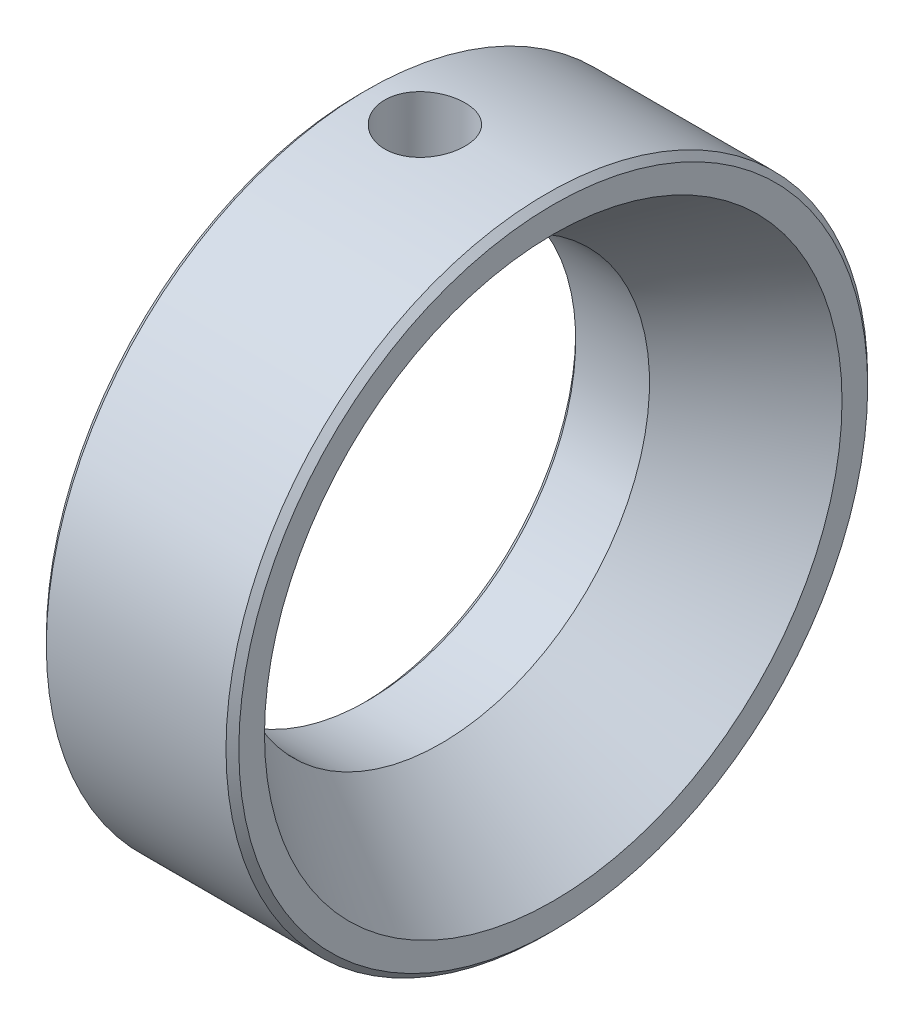
ISO-10303-21;
HEADER;
FILE_DESCRIPTION(('STEP AP214'),'2;1');
FILE_NAME('part.step','',(''),(''),'','','');
FILE_SCHEMA(('AUTOMOTIVE_DESIGN { 1 0 10303 214 1 1 1 1 }'));
ENDSEC;
DATA;
#1=APPLICATION_CONTEXT('core data for automotive mechanical design processes');
#2=APPLICATION_PROTOCOL_DEFINITION('international standard','automotive_design',2000,#1);
#3=PRODUCT_CONTEXT('',#1,'mechanical');
#4=PRODUCT('Part','Part','',(#3));
#5=PRODUCT_RELATED_PRODUCT_CATEGORY('part','',(#4));
#6=PRODUCT_DEFINITION_FORMATION('','',#4);
#7=PRODUCT_DEFINITION_CONTEXT('part definition',#1,'design');
#8=PRODUCT_DEFINITION('design','',#6,#7);
#9=PRODUCT_DEFINITION_SHAPE('','',#8);
#10=(LENGTH_UNIT() NAMED_UNIT(*) SI_UNIT(.MILLI.,.METRE.));
#11=(NAMED_UNIT(*) PLANE_ANGLE_UNIT() SI_UNIT($,.RADIAN.));
#12=(NAMED_UNIT(*) SI_UNIT($,.STERADIAN.) SOLID_ANGLE_UNIT());
#13=UNCERTAINTY_MEASURE_WITH_UNIT(LENGTH_MEASURE(1.E-05),#10,'distance_accuracy_value','');
#14=(GEOMETRIC_REPRESENTATION_CONTEXT(3) GLOBAL_UNCERTAINTY_ASSIGNED_CONTEXT((#13)) GLOBAL_UNIT_ASSIGNED_CONTEXT((#10,
#11,#12)) REPRESENTATION_CONTEXT('',''));
#15=CARTESIAN_POINT('',(0.,0.,0.));
#16=DIRECTION('',(0.,0.,1.));
#17=DIRECTION('',(1.,0.,0.));
#18=AXIS2_PLACEMENT_3D('',#15,#16,#17);
#19=CARTESIAN_POINT('',(-193.536585365854,0.,0.));
#20=DIRECTION('',(-1.,0.,0.));
#21=DIRECTION('',(0.,0.,1.));
#22=AXIS2_PLACEMENT_3D('',#19,#20,#21);
#23=CYLINDRICAL_SURFACE('',#22,100.);
#24=CARTESIAN_POINT('',(-30.1829268292683,100.,0.));
#25=CARTESIAN_POINT('',(-30.1829308421279,100.000001345279,-0.349725302501324));
#26=CARTESIAN_POINT('',(-30.1682446528815,99.9981617707791,-0.699391688691775));
#27=CARTESIAN_POINT('',(-30.1096127013227,99.9908577480781,-1.39633535762782));
#28=CARTESIAN_POINT('',(-30.0656603069873,99.9853924782585,-1.74361208082529));
#29=CARTESIAN_POINT('',(-29.9487579484735,99.9709821059211,-2.4334997742603));
#30=CARTESIAN_POINT('',(-29.8757810800272,99.9620337749405,-2.77610610966412));
#31=CARTESIAN_POINT('',(-29.7013728646584,99.9409103293127,-3.45389697652515));
#32=CARTESIAN_POINT('',(-29.5999415290887,99.9287352159529,-3.78908151094348));
#33=CARTESIAN_POINT('',(-29.3694483377499,99.9015100461544,-4.44943040062663));
#34=CARTESIAN_POINT('',(-29.2404054994425,99.886461969238,-4.77460147722778));
#35=CARTESIAN_POINT('',(-28.9555819271767,99.853907029794,-5.41289046787238));
#36=CARTESIAN_POINT('',(-28.7998008408267,99.8364001348614,-5.7260082229948));
#37=CARTESIAN_POINT('',(-28.4626485483228,99.7994205602292,-6.33795030702529));
#38=CARTESIAN_POINT('',(-28.2812820790651,99.7799482445985,-6.63677726805936));
#39=CARTESIAN_POINT('',(-27.8942201264416,99.7395783001712,-7.21813259637454));
#40=CARTESIAN_POINT('',(-27.6885246215371,99.7186806701129,-7.50066094922603));
#41=CARTESIAN_POINT('',(-27.2531746137099,99.675937434488,-8.04881727021103));
#42=CARTESIAN_POINT('',(-27.0234072680124,99.6540876726453,-8.31435530001055));
#43=CARTESIAN_POINT('',(-26.542365927537,99.6101516457911,-8.82515837005227));
#44=CARTESIAN_POINT('',(-26.291091848628,99.5880653798548,-9.0704233309819));
#45=CARTESIAN_POINT('',(-25.7687755771602,99.5442777895226,-9.53898032252259));
#46=CARTESIAN_POINT('',(-25.4977323948294,99.5225764844681,-9.76227125165179));
#47=CARTESIAN_POINT('',(-24.9377747758836,99.4801733884383,-10.1852986009129));
#48=CARTESIAN_POINT('',(-24.6488603244582,99.4594715982913,-10.3850350015242));
#49=CARTESIAN_POINT('',(-24.0541692527072,99.4195877835601,-10.7601710724128));
#50=CARTESIAN_POINT('',(-23.7483389975624,99.4004111257622,-10.9354863036889));
#51=CARTESIAN_POINT('',(-23.1228650067697,99.3642061645942,-11.2597139301568));
#52=CARTESIAN_POINT('',(-22.8032212302763,99.3471778675772,-11.4086262472709));
#53=CARTESIAN_POINT('',(-22.1523953159606,99.3157616880652,-11.67895586429));
#54=CARTESIAN_POINT('',(-21.8212135201729,99.3013737273788,-11.8003739784381));
#55=CARTESIAN_POINT('',(-21.1496673648154,99.2756552541175,-12.0148220292573));
#56=CARTESIAN_POINT('',(-20.8093030570993,99.2643247242812,-12.107852126199));
#57=CARTESIAN_POINT('',(-20.1236366767638,99.2451018631555,-12.2644181009037));
#58=CARTESIAN_POINT('',(-19.7783697364557,99.2371918608503,-12.3281056815745));
#59=CARTESIAN_POINT('',(-19.0836404926096,99.2249534232538,-12.4262250351781));
#60=CARTESIAN_POINT('',(-18.7341782021958,99.2206249767614,-12.4606568996074));
#61=CARTESIAN_POINT('',(-18.0335821537417,99.2156754886221,-12.5000053033855));
#62=CARTESIAN_POINT('',(-17.682448455685,99.2150543149174,-12.5049228940704));
#63=CARTESIAN_POINT('',(-16.9810254626856,99.2175371041919,-12.4852084121194));
#64=CARTESIAN_POINT('',(-16.630736165152,99.220641055727,-12.4605764302642));
#65=CARTESIAN_POINT('',(-15.9355162025646,99.2304555991274,-12.382173751902));
#66=CARTESIAN_POINT('',(-15.5905663508661,99.237145469763,-12.3285704514853));
#67=CARTESIAN_POINT('',(-14.9064372300568,99.2539266243776,-12.1927325098527));
#68=CARTESIAN_POINT('',(-14.5672579355185,99.2640178933644,-12.1104979948326));
#69=CARTESIAN_POINT('',(-13.8970544914576,99.2873136864925,-11.9180002651356));
#70=CARTESIAN_POINT('',(-13.566030458176,99.3005182549808,-11.8077366511996));
#71=CARTESIAN_POINT('',(-12.9144581537063,99.3296650304773,-11.5599822787197));
#72=CARTESIAN_POINT('',(-12.5939099261978,99.3456072488984,-11.4224914066666));
#73=CARTESIAN_POINT('',(-11.964649835035,99.3798254479636,-11.1208534991564));
#74=CARTESIAN_POINT('',(-11.655973079477,99.3981077480071,-10.9566339439906));
#75=CARTESIAN_POINT('',(-11.0535365537553,99.4364542478611,-10.6029800579611));
#76=CARTESIAN_POINT('',(-10.7597768009632,99.4565184497466,-10.4135456977343));
#77=CARTESIAN_POINT('',(-10.1891919761901,99.4978646888732,-10.0107885709071));
#78=CARTESIAN_POINT('',(-9.91236755821702,99.5191467730852,-9.79746488264905));
#79=CARTESIAN_POINT('',(-9.37757237922909,99.5623315265523,-9.34842235278798));
#80=CARTESIAN_POINT('',(-9.11960170910809,99.5842341987986,-9.11270340323013));
#81=CARTESIAN_POINT('',(-8.62257802168058,99.6281998497906,-8.61879746682115));
#82=CARTESIAN_POINT('',(-8.38366829747984,99.6502628888288,-8.36046626355238));
#83=CARTESIAN_POINT('',(-7.92844534838279,99.6937739130566,-7.82455741667241));
#84=CARTESIAN_POINT('',(-7.71213223392396,99.7152218952398,-7.54697967900773));
#85=CARTESIAN_POINT('',(-7.30363146082641,99.7568968625953,-6.97451605889336));
#86=CARTESIAN_POINT('',(-7.11144392583282,99.7771238415095,-6.67963008774923));
#87=CARTESIAN_POINT('',(-6.75256851011785,99.8157847899396,-6.07461720633715));
#88=CARTESIAN_POINT('',(-6.58588057860595,99.8342187630268,-5.76449032642793));
#89=CARTESIAN_POINT('',(-6.27915552239912,99.8687776860624,-5.1310688265766));
#90=CARTESIAN_POINT('',(-6.13912756833787,99.8849018409974,-4.8077697218442));
#91=CARTESIAN_POINT('',(-5.88681863696447,99.9143756349882,-4.15039527297815));
#92=CARTESIAN_POINT('',(-5.77453768800354,99.9277252712089,-3.81631991783399));
#93=CARTESIAN_POINT('',(-5.57855880569539,99.951269389874,-3.13979202368483));
#94=CARTESIAN_POINT('',(-5.49485977920121,99.9614639929846,-2.7973398055991));
#95=CARTESIAN_POINT('',(-5.35666609983282,99.9784076346653,-2.10650904190151));
#96=CARTESIAN_POINT('',(-5.30217127587821,99.9851566934196,-1.75813053101865));
#97=CARTESIAN_POINT('',(-5.22306200719287,99.9949833720168,-1.06030607221765));
#98=CARTESIAN_POINT('',(-5.19825032336989,99.9980852244931,-0.710882813975566));
#99=CARTESIAN_POINT('',(-5.17803283324892,100.000611355936,-0.0111740603037201));
#100=CARTESIAN_POINT('',(-5.1826268965264,100.000035651213,0.339111431294859));
#101=CARTESIAN_POINT('',(-5.2211858996996,99.9952230026219,1.03802908018944));
#102=CARTESIAN_POINT('',(-5.25515024250274,99.9909861331841,1.38666127095188));
#103=CARTESIAN_POINT('',(-5.35219505244865,99.9789709513484,2.07978699929301));
#104=CARTESIAN_POINT('',(-5.41527550386285,99.9711926408635,2.42428053910729));
#105=CARTESIAN_POINT('',(-5.56982800834461,99.9523451869168,3.10554980386403));
#106=CARTESIAN_POINT('',(-5.66120579599228,99.9412869747056,3.44234722454708));
#107=CARTESIAN_POINT('',(-5.87175059246936,99.9161797166496,4.10702412107202));
#108=CARTESIAN_POINT('',(-5.990917518939,99.9021306796689,4.43490362334108));
#109=CARTESIAN_POINT('',(-6.25618167535476,99.8714331571812,5.07946403942911));
#110=CARTESIAN_POINT('',(-6.40227960909212,99.8547846037425,5.39614466032855));
#111=CARTESIAN_POINT('',(-6.72035950896125,99.8193514106512,6.01610344887656));
#112=CARTESIAN_POINT('',(-6.89234161307456,99.8005667596119,6.31938154506873));
#113=CARTESIAN_POINT('',(-7.26192630539513,99.7612817206722,6.91196886261612));
#114=CARTESIAN_POINT('',(-7.45965642323586,99.7407729856538,7.20119799625119));
#115=CARTESIAN_POINT('',(-7.87864621807645,99.6986985332722,7.76199685820717));
#116=CARTESIAN_POINT('',(-8.09990596627214,99.6771328127107,8.03356653309016));
#117=CARTESIAN_POINT('',(-8.56441633076746,99.6335474718823,8.55717560628055));
#118=CARTESIAN_POINT('',(-8.80766771783451,99.6115278357273,8.80921431948745));
#119=CARTESIAN_POINT('',(-9.31446517253888,99.5676525670739,9.29200370775106));
#120=CARTESIAN_POINT('',(-9.57801130279552,99.5457969350817,9.52275431711862));
#121=CARTESIAN_POINT('',(-10.1251303053593,99.5027412323395,9.96261083701284));
#122=CARTESIAN_POINT('',(-10.4088088032197,99.4815456102776,10.1715858247015));
#123=CARTESIAN_POINT('',(-10.9928607351852,99.4405457675856,10.5648931883582));
#124=CARTESIAN_POINT('',(-11.293234242336,99.4207415530441,10.7492254564947));
#125=CARTESIAN_POINT('',(-11.908560415493,99.3830922427853,11.0919207732139));
#126=CARTESIAN_POINT('',(-12.2235128780247,99.3652471197372,11.2502841840966));
#127=CARTESIAN_POINT('',(-12.8657742167941,99.332029711982,11.5398930785201));
#128=CARTESIAN_POINT('',(-13.1930830414158,99.3166574169467,11.6711386753246));
#129=CARTESIAN_POINT('',(-13.8568567233933,99.2888672369928,11.905238844708));
#130=CARTESIAN_POINT('',(-14.1932953199688,99.2764417103811,12.0081669650505));
#131=CARTESIAN_POINT('',(-14.8737493069479,99.2548530398919,12.1853239939489));
#132=CARTESIAN_POINT('',(-15.2177646889562,99.2456898923997,12.2595529343024));
#133=CARTESIAN_POINT('',(-15.9108892427273,99.2308927603771,12.3787533888797));
#134=CARTESIAN_POINT('',(-16.2599982149075,99.2252586379466,12.4237260463235));
#135=CARTESIAN_POINT('',(-16.9608040508212,99.21768340203,12.4840790461015));
#136=CARTESIAN_POINT('',(-17.3125009014812,99.2157422699004,12.4994595378272));
#137=CARTESIAN_POINT('',(-18.0134957697964,99.2156100479243,12.5005088092685));
#138=CARTESIAN_POINT('',(-18.3627934925759,99.2173930205935,12.4863830925103));
#139=CARTESIAN_POINT('',(-19.0589408643468,99.2246051689259,12.4289405970189));
#140=CARTESIAN_POINT('',(-19.4057905254186,99.2300343265837,12.3856239624353));
#141=CARTESIAN_POINT('',(-20.0945740219008,99.2443826149695,12.2701222179287));
#142=CARTESIAN_POINT('',(-20.4365078705241,99.2533017363153,12.1979371856139));
#143=CARTESIAN_POINT('',(-21.1130407461294,99.2743741261147,12.0252318198025));
#144=CARTESIAN_POINT('',(-21.4476397585354,99.2865274009947,11.9247114300022));
#145=CARTESIAN_POINT('',(-22.1070277151367,99.3137159817713,11.6961126097447));
#146=CARTESIAN_POINT('',(-22.4318202069741,99.3287502306185,11.5680442847112));
#147=CARTESIAN_POINT('',(-23.0694564116104,99.3612766921775,11.2852531014634));
#148=CARTESIAN_POINT('',(-23.3823001349142,99.3787689027282,11.130530266683));
#149=CARTESIAN_POINT('',(-23.9938727160218,99.4157173583872,10.7955326014385));
#150=CARTESIAN_POINT('',(-24.29260151103,99.435173612232,10.6152576573105));
#151=CARTESIAN_POINT('',(-24.8738851998948,99.4755035085504,10.2304260051014));
#152=CARTESIAN_POINT('',(-25.1564400158457,99.4963771578501,10.0258691800758));
#153=CARTESIAN_POINT('',(-25.7052616425809,99.5391003372653,9.59245644059898));
#154=CARTESIAN_POINT('',(-25.9714071401386,99.5609554513949,9.36344744239317));
#155=CARTESIAN_POINT('',(-26.4834900950421,99.6048935548174,8.8838698846986));
#156=CARTESIAN_POINT('',(-26.7294273947168,99.6269765458867,8.63330115702491));
#157=CARTESIAN_POINT('',(-27.1994333516875,99.6707535770599,8.11228834775018));
#158=CARTESIAN_POINT('',(-27.4234967399582,99.6924475224274,7.84183950475999));
#159=CARTESIAN_POINT('',(-27.84811121294,99.7348300852988,7.28300581585434));
#160=CARTESIAN_POINT('',(-28.0486626054151,99.7555187159597,6.99462120478754));
#161=CARTESIAN_POINT('',(-28.4255550705093,99.79538464168,6.4007873474434));
#162=CARTESIAN_POINT('',(-28.6018007040372,99.8145558596506,6.09527710565898));
#163=CARTESIAN_POINT('',(-28.9278982060641,99.8507541877945,5.47036008667538));
#164=CARTESIAN_POINT('',(-29.0777500521162,99.8677812961442,5.15095329765798));
#165=CARTESIAN_POINT('',(-29.3498338961576,99.8991914612787,4.50081318290417));
#166=CARTESIAN_POINT('',(-29.4720924794862,99.9135770605704,4.17009111606338));
#167=CARTESIAN_POINT('',(-29.6882415175135,99.9393120718224,3.49950505378495));
#168=CARTESIAN_POINT('',(-29.7821386637227,99.9506621998899,3.15964323539267));
#169=CARTESIAN_POINT('',(-29.9681530455595,99.9733233071915,2.35522086598522));
#170=CARTESIAN_POINT('',(-30.0486103092701,99.9832852248437,1.88787724261847));
#171=CARTESIAN_POINT('',(-30.1559942875601,99.9966226363805,0.946986391758157));
#172=CARTESIAN_POINT('',(-30.1829213968759,99.9999981788335,0.473439210036155));
#173=CARTESIAN_POINT('',(-30.1829268292683,100.,0.));
#174=B_SPLINE_CURVE_WITH_KNOTS('',3,(#24,#25,#26,#27,#28,#29,#30,#31,#32,#33,#34,#35,#36,#37,
#38,#39,#40,#41,#42,#43,#44,#45,#46,#47,#48,#49,#50,#51,#52,#53,#54,#55,#56,#57,#58,#59,#60,#61,
#62,#63,#64,#65,#66,#67,#68,#69,#70,#71,#72,#73,#74,#75,#76,#77,#78,#79,#80,#81,#82,#83,#84,#85,
#86,#87,#88,#89,#90,#91,#92,#93,#94,#95,#96,#97,#98,#99,#100,#101,#102,#103,#104,#105,#106,#107,
#108,#109,#110,#111,#112,#113,#114,#115,#116,#117,#118,#119,#120,#121,#122,#123,#124,#125,#126,
#127,#128,#129,#130,#131,#132,#133,#134,#135,#136,#137,#138,#139,#140,#141,#142,#143,#144,#145,
#146,#147,#148,#149,#150,#151,#152,#153,#154,#155,#156,#157,#158,#159,#160,#161,#162,#163,#164,
#165,#166,#167,#168,#169,#170,#171,#172,#173),.UNSPECIFIED.,.T.,.F.,(4,2,2,2,2,2,2,2,2,2,2,2,2,
2,2,2,2,2,2,2,2,2,2,2,2,2,2,2,2,2,2,2,2,2,2,2,2,2,2,2,2,2,2,2,2,2,2,2,2,2,2,2,2,2,2,2,2,2,2,2,2,
2,2,2,2,2,2,2,2,2,2,2,2,2,4),(0.,1.04876159455992,2.09776093020135,3.14773491168115,
4.19770847423894,5.24696118053668,6.29622771632108,7.3453002444715,8.39437370138136,
9.44860590484802,10.5028422325003,11.5571313784677,12.6114213981647,13.6692707719302,
14.7271232738796,15.7849444433466,16.8427596405552,17.8950427319002,18.9473225322459,
19.9995648488176,21.0518039327532,22.0980271875687,23.1442458310833,24.1904793782446,
25.2367172871959,26.2858426531258,27.3349692407882,28.3841363180278,29.4333084529622,
30.4897422429057,31.5461811957667,32.6026255627239,33.6590678254101,34.7158728344578,
35.7726789233195,36.8294445889462,37.8862040638933,38.935901853545,39.985594987432,
41.0352667817453,42.0849380090248,43.1311494682331,44.1773578267828,45.2235935298978,
46.2698348104112,47.3214706183476,48.373109608409,49.4247854708266,50.4764645783147,
51.5341404647314,52.5918209791686,53.6494867363024,54.7071480757664,55.762035891365,
56.8169225381841,57.8717679617204,58.9266080600129,59.9741259579594,61.0216386831255,
62.0691485922347,63.1166605828133,64.1637889673252,65.2109164312294,66.2580485532355,
67.3051857185656,68.3593125968065,69.4134476989138,70.4678360995725,71.5222106971097,
72.5806141992662,73.6390186015518,74.6963988656732,75.7535294595138,77.1732966846938,
78.5930534403344),.UNSPECIFIED.);
#175=CARTESIAN_POINT('',(-30.1829268292683,100.,0.));
#176=VERTEX_POINT('',#175);
#177=EDGE_CURVE('E10',#176,#176,#174,.T.);
#178=ORIENTED_EDGE('',*,*,#177,.T.);
#179=EDGE_LOOP('',(#178));
#180=FACE_BOUND('',#179,.T.);
#181=CARTESIAN_POINT('',(20.3170731707317,0.,0.));
#182=DIRECTION('',(1.,0.,0.));
#183=DIRECTION('',(0.,0.,-1.));
#184=AXIS2_PLACEMENT_3D('',#181,#182,#183);
#185=CIRCLE('',#184,100.);
#186=CARTESIAN_POINT('',(20.3170731707317,0.,-100.));
#187=VERTEX_POINT('',#186);
#188=EDGE_CURVE('E95',#187,#187,#185,.F.);
#189=ORIENTED_EDGE('',*,*,#188,.T.);
#190=EDGE_LOOP('',(#189));
#191=FACE_BOUND('',#190,.T.);
#192=CARTESIAN_POINT('',(-35.6829268292683,0.,0.));
#193=DIRECTION('',(-1.,0.,0.));
#194=DIRECTION('',(0.,0.,1.));
#195=AXIS2_PLACEMENT_3D('',#192,#193,#194);
#196=CIRCLE('',#195,100.);
#197=CARTESIAN_POINT('',(-35.6829268292683,0.,100.));
#198=VERTEX_POINT('',#197);
#199=EDGE_CURVE('E53',#198,#198,#196,.F.);
#200=ORIENTED_EDGE('',*,*,#199,.T.);
#201=EDGE_LOOP('',(#200));
#202=FACE_BOUND('',#201,.T.);
#203=CARTESIAN_POINT('',(-30.1829268292683,-100.,0.));
#204=CARTESIAN_POINT('',(-30.1829308421279,-100.000001345279,0.349725302501324));
#205=CARTESIAN_POINT('',(-30.1682446528814,-99.9981617707791,0.699391688691774));
#206=CARTESIAN_POINT('',(-30.1096127013226,-99.9908577480781,1.39633535762782));
#207=CARTESIAN_POINT('',(-30.0656603069873,-99.9853924782585,1.74361208082529));
#208=CARTESIAN_POINT('',(-29.9487579484735,-99.9709821059211,2.4334997742603));
#209=CARTESIAN_POINT('',(-29.8757810800272,-99.9620337749405,2.77610610966411));
#210=CARTESIAN_POINT('',(-29.7013728646583,-99.9409103293127,3.45389697652514));
#211=CARTESIAN_POINT('',(-29.5999415290887,-99.9287352159529,3.78908151094348));
#212=CARTESIAN_POINT('',(-29.3694483377499,-99.9015100461544,4.44943040062663));
#213=CARTESIAN_POINT('',(-29.2404054994425,-99.886461969238,4.77460147722778));
#214=CARTESIAN_POINT('',(-28.9555819271767,-99.853907029794,5.41289046787238));
#215=CARTESIAN_POINT('',(-28.7998008408267,-99.8364001348615,5.7260082229948));
#216=CARTESIAN_POINT('',(-28.4626485483227,-99.7994205602293,6.33795030702528));
#217=CARTESIAN_POINT('',(-28.2812820790651,-99.7799482445985,6.63677726805935));
#218=CARTESIAN_POINT('',(-27.8942201264416,-99.7395783001712,7.21813259637453));
#219=CARTESIAN_POINT('',(-27.6885246215371,-99.7186806701129,7.50066094922602));
#220=CARTESIAN_POINT('',(-27.2531746137099,-99.675937434488,8.04881727021102));
#221=CARTESIAN_POINT('',(-27.0234072680124,-99.6540876726453,8.31435530001054));
#222=CARTESIAN_POINT('',(-26.5423659275369,-99.6101516457911,8.82515837005226));
#223=CARTESIAN_POINT('',(-26.291091848628,-99.5880653798547,9.07042333098189));
#224=CARTESIAN_POINT('',(-25.7687755771602,-99.5442777895226,9.53898032252258));
#225=CARTESIAN_POINT('',(-25.4977323948294,-99.5225764844681,9.76227125165177));
#226=CARTESIAN_POINT('',(-24.9377747758836,-99.4801733884383,10.1852986009129));
#227=CARTESIAN_POINT('',(-24.6488603244581,-99.4594715982913,10.3850350015242));
#228=CARTESIAN_POINT('',(-24.0541692527071,-99.41958778356,10.7601710724128));
#229=CARTESIAN_POINT('',(-23.7483389975624,-99.4004111257622,10.9354863036889));
#230=CARTESIAN_POINT('',(-23.1228650067696,-99.3642061645943,11.2597139301568));
#231=CARTESIAN_POINT('',(-22.8032212302763,-99.3471778675772,11.4086262472709));
#232=CARTESIAN_POINT('',(-22.1523953159606,-99.3157616880652,11.67895586429));
#233=CARTESIAN_POINT('',(-21.8212135201728,-99.3013737273788,11.8003739784381));
#234=CARTESIAN_POINT('',(-21.1496673648154,-99.2756552541175,12.0148220292573));
#235=CARTESIAN_POINT('',(-20.8093030570993,-99.2643247242812,12.107852126199));
#236=CARTESIAN_POINT('',(-20.1236366767637,-99.2451018631555,12.2644181009037));
#237=CARTESIAN_POINT('',(-19.7783697364557,-99.2371918608503,12.3281056815745));
#238=CARTESIAN_POINT('',(-19.0836404926096,-99.2249534232538,12.4262250351781));
#239=CARTESIAN_POINT('',(-18.7341782021957,-99.2206249767614,12.4606568996074));
#240=CARTESIAN_POINT('',(-18.0335821537417,-99.2156754886221,12.5000053033854));
#241=CARTESIAN_POINT('',(-17.682448455685,-99.2150543149174,12.5049228940704));
#242=CARTESIAN_POINT('',(-16.9810254626856,-99.2175371041919,12.4852084121194));
#243=CARTESIAN_POINT('',(-16.630736165152,-99.220641055727,12.4605764302642));
#244=CARTESIAN_POINT('',(-15.9355162025646,-99.2304555991274,12.382173751902));
#245=CARTESIAN_POINT('',(-15.5905663508661,-99.2371454697631,12.3285704514853));
#246=CARTESIAN_POINT('',(-14.9064372300568,-99.2539266243776,12.1927325098527));
#247=CARTESIAN_POINT('',(-14.5672579355185,-99.2640178933644,12.1104979948325));
#248=CARTESIAN_POINT('',(-13.8970544914576,-99.2873136864925,11.9180002651355));
#249=CARTESIAN_POINT('',(-13.566030458176,-99.3005182549808,11.8077366511996));
#250=CARTESIAN_POINT('',(-12.9144581537062,-99.3296650304773,11.5599822787196));
#251=CARTESIAN_POINT('',(-12.5939099261977,-99.3456072488984,11.4224914066665));
#252=CARTESIAN_POINT('',(-11.964649835035,-99.3798254479636,11.1208534991564));
#253=CARTESIAN_POINT('',(-11.655973079477,-99.3981077480071,10.9566339439906));
#254=CARTESIAN_POINT('',(-11.0535365537553,-99.4364542478611,10.602980057961));
#255=CARTESIAN_POINT('',(-10.7597768009632,-99.4565184497466,10.4135456977343));
#256=CARTESIAN_POINT('',(-10.1891919761901,-99.4978646888733,10.0107885709071));
#257=CARTESIAN_POINT('',(-9.912367558217,-99.5191467730852,9.79746488264903));
#258=CARTESIAN_POINT('',(-9.37757237922907,-99.5623315265523,9.34842235278796));
#259=CARTESIAN_POINT('',(-9.11960170910808,-99.5842341987986,9.11270340323011));
#260=CARTESIAN_POINT('',(-8.62257802168057,-99.6281998497906,8.61879746682114));
#261=CARTESIAN_POINT('',(-8.38366829747983,-99.6502628888288,8.36046626355237));
#262=CARTESIAN_POINT('',(-7.92844534838278,-99.6937739130566,7.8245574166724));
#263=CARTESIAN_POINT('',(-7.71213223392396,-99.7152218952398,7.54697967900773));
#264=CARTESIAN_POINT('',(-7.3036314608264,-99.7568968625953,6.97451605889336));
#265=CARTESIAN_POINT('',(-7.11144392583281,-99.7771238415095,6.67963008774923));
#266=CARTESIAN_POINT('',(-6.75256851011784,-99.8157847899396,6.07461720633715));
#267=CARTESIAN_POINT('',(-6.58588057860594,-99.8342187630268,5.76449032642792));
#268=CARTESIAN_POINT('',(-6.27915552239911,-99.8687776860624,5.13106882657659));
#269=CARTESIAN_POINT('',(-6.13912756833786,-99.8849018409974,4.80776972184419));
#270=CARTESIAN_POINT('',(-5.88681863696446,-99.9143756349882,4.15039527297815));
#271=CARTESIAN_POINT('',(-5.77453768800353,-99.9277252712089,3.81631991783398));
#272=CARTESIAN_POINT('',(-5.57855880569538,-99.951269389874,3.13979202368483));
#273=CARTESIAN_POINT('',(-5.4948597792012,-99.9614639929846,2.79733980559909));
#274=CARTESIAN_POINT('',(-5.35666609983281,-99.9784076346653,2.1065090419015));
#275=CARTESIAN_POINT('',(-5.3021712758782,-99.9851566934196,1.75813053101865));
#276=CARTESIAN_POINT('',(-5.22306200719286,-99.9949833720168,1.06030607221764));
#277=CARTESIAN_POINT('',(-5.19825032336989,-99.9980852244931,0.710882813975564));
#278=CARTESIAN_POINT('',(-5.17803283324891,-100.000611355936,0.0111740603037193));
#279=CARTESIAN_POINT('',(-5.18262689652639,-100.000035651213,-0.33911143129486));
#280=CARTESIAN_POINT('',(-5.2211858996996,-99.9952230026219,-1.03802908018944));
#281=CARTESIAN_POINT('',(-5.25515024250274,-99.9909861331841,-1.38666127095188));
#282=CARTESIAN_POINT('',(-5.35219505244864,-99.9789709513484,-2.07978699929301));
#283=CARTESIAN_POINT('',(-5.41527550386284,-99.9711926408635,-2.42428053910729));
#284=CARTESIAN_POINT('',(-5.5698280083446,-99.9523451869168,-3.10554980386403));
#285=CARTESIAN_POINT('',(-5.66120579599228,-99.9412869747056,-3.44234722454708));
#286=CARTESIAN_POINT('',(-5.87175059246935,-99.9161797166496,-4.10702412107201));
#287=CARTESIAN_POINT('',(-5.99091751893899,-99.9021306796689,-4.43490362334108));
#288=CARTESIAN_POINT('',(-6.25618167535475,-99.8714331571812,-5.07946403942911));
#289=CARTESIAN_POINT('',(-6.40227960909211,-99.8547846037425,-5.39614466032855));
#290=CARTESIAN_POINT('',(-6.72035950896124,-99.8193514106512,-6.01610344887656));
#291=CARTESIAN_POINT('',(-6.89234161307455,-99.8005667596119,-6.31938154506873));
#292=CARTESIAN_POINT('',(-7.26192630539513,-99.7612817206722,-6.91196886261612));
#293=CARTESIAN_POINT('',(-7.45965642323586,-99.7407729856538,-7.20119799625118));
#294=CARTESIAN_POINT('',(-7.87864621807644,-99.6986985332722,-7.76199685820716));
#295=CARTESIAN_POINT('',(-8.09990596627214,-99.6771328127107,-8.03356653309016));
#296=CARTESIAN_POINT('',(-8.56441633076746,-99.6335474718823,-8.55717560628055));
#297=CARTESIAN_POINT('',(-8.80766771783451,-99.6115278357273,-8.80921431948745));
#298=CARTESIAN_POINT('',(-9.31446517253888,-99.5676525670739,-9.29200370775106));
#299=CARTESIAN_POINT('',(-9.57801130279552,-99.5457969350817,-9.52275431711861));
#300=CARTESIAN_POINT('',(-10.1251303053592,-99.5027412323395,-9.96261083701283));
#301=CARTESIAN_POINT('',(-10.4088088032197,-99.4815456102776,-10.1715858247015));
#302=CARTESIAN_POINT('',(-10.9928607351852,-99.4405457675856,-10.5648931883582));
#303=CARTESIAN_POINT('',(-11.293234242336,-99.4207415530441,-10.7492254564947));
#304=CARTESIAN_POINT('',(-11.908560415493,-99.3830922427853,-11.0919207732139));
#305=CARTESIAN_POINT('',(-12.2235128780247,-99.3652471197372,-11.2502841840966));
#306=CARTESIAN_POINT('',(-12.8657742167941,-99.332029711982,-11.5398930785201));
#307=CARTESIAN_POINT('',(-13.1930830414158,-99.3166574169467,-11.6711386753246));
#308=CARTESIAN_POINT('',(-13.8568567233933,-99.2888672369928,-11.905238844708));
#309=CARTESIAN_POINT('',(-14.1932953199688,-99.2764417103811,-12.0081669650505));
#310=CARTESIAN_POINT('',(-14.8737493069479,-99.2548530398919,-12.1853239939489));
#311=CARTESIAN_POINT('',(-15.2177646889562,-99.2456898923997,-12.2595529343024));
#312=CARTESIAN_POINT('',(-15.9108892427273,-99.2308927603771,-12.3787533888797));
#313=CARTESIAN_POINT('',(-16.2599982149075,-99.2252586379466,-12.4237260463235));
#314=CARTESIAN_POINT('',(-16.9608040508212,-99.21768340203,-12.4840790461014));
#315=CARTESIAN_POINT('',(-17.3125009014812,-99.2157422699004,-12.4994595378272));
#316=CARTESIAN_POINT('',(-18.0134957697964,-99.2156100479243,-12.5005088092684));
#317=CARTESIAN_POINT('',(-18.3627934925759,-99.2173930205935,-12.4863830925103));
#318=CARTESIAN_POINT('',(-19.0589408643468,-99.2246051689259,-12.4289405970189));
#319=CARTESIAN_POINT('',(-19.4057905254186,-99.2300343265837,-12.3856239624353));
#320=CARTESIAN_POINT('',(-20.0945740219008,-99.2443826149695,-12.2701222179287));
#321=CARTESIAN_POINT('',(-20.436507870524,-99.2533017363153,-12.1979371856138));
#322=CARTESIAN_POINT('',(-21.1130407461294,-99.2743741261147,-12.0252318198025));
#323=CARTESIAN_POINT('',(-21.4476397585354,-99.2865274009947,-11.9247114300022));
#324=CARTESIAN_POINT('',(-22.1070277151367,-99.3137159817713,-11.6961126097447));
#325=CARTESIAN_POINT('',(-22.4318202069741,-99.3287502306185,-11.5680442847112));
#326=CARTESIAN_POINT('',(-23.0694564116104,-99.3612766921775,-11.2852531014633));
#327=CARTESIAN_POINT('',(-23.3823001349142,-99.3787689027282,-11.130530266683));
#328=CARTESIAN_POINT('',(-23.9938727160218,-99.4157173583872,-10.7955326014385));
#329=CARTESIAN_POINT('',(-24.29260151103,-99.435173612232,-10.6152576573105));
#330=CARTESIAN_POINT('',(-24.8738851998948,-99.4755035085504,-10.2304260051014));
#331=CARTESIAN_POINT('',(-25.1564400158457,-99.4963771578501,-10.0258691800758));
#332=CARTESIAN_POINT('',(-25.7052616425809,-99.5391003372653,-9.59245644059897));
#333=CARTESIAN_POINT('',(-25.9714071401386,-99.5609554513949,-9.36344744239315));
#334=CARTESIAN_POINT('',(-26.4834900950421,-99.6048935548174,-8.88386988469858));
#335=CARTESIAN_POINT('',(-26.7294273947168,-99.6269765458867,-8.63330115702489));
#336=CARTESIAN_POINT('',(-27.1994333516874,-99.6707535770599,-8.11228834775016));
#337=CARTESIAN_POINT('',(-27.4234967399581,-99.6924475224274,-7.84183950475997));
#338=CARTESIAN_POINT('',(-27.84811121294,-99.7348300852988,-7.28300581585432));
#339=CARTESIAN_POINT('',(-28.048662605415,-99.7555187159597,-6.99462120478752));
#340=CARTESIAN_POINT('',(-28.4255550705093,-99.79538464168,-6.4007873474434));
#341=CARTESIAN_POINT('',(-28.6018007040371,-99.8145558596506,-6.09527710565898));
#342=CARTESIAN_POINT('',(-28.927898206064,-99.8507541877945,-5.47036008667538));
#343=CARTESIAN_POINT('',(-29.0777500521161,-99.8677812961442,-5.15095329765798));
#344=CARTESIAN_POINT('',(-29.3498338961576,-99.8991914612787,-4.50081318290417));
#345=CARTESIAN_POINT('',(-29.4720924794862,-99.9135770605704,-4.17009111606338));
#346=CARTESIAN_POINT('',(-29.6882415175134,-99.9393120718224,-3.49950505378495));
#347=CARTESIAN_POINT('',(-29.7821386637227,-99.9506621998899,-3.15964323539267));
#348=CARTESIAN_POINT('',(-29.9681530455594,-99.9733233071915,-2.35522086598522));
#349=CARTESIAN_POINT('',(-30.0486103092701,-99.9832852248437,-1.88787724261847));
#350=CARTESIAN_POINT('',(-30.15599428756,-99.9966226363805,-0.946986391758155));
#351=CARTESIAN_POINT('',(-30.1829213968758,-99.9999981788335,-0.473439210036154));
#352=CARTESIAN_POINT('',(-30.1829268292683,-100.,0.));
#353=B_SPLINE_CURVE_WITH_KNOTS('',3,(#203,#204,#205,#206,#207,#208,#209,#210,#211,#212,#213,
#214,#215,#216,#217,#218,#219,#220,#221,#222,#223,#224,#225,#226,#227,#228,#229,#230,#231,#232,
#233,#234,#235,#236,#237,#238,#239,#240,#241,#242,#243,#244,#245,#246,#247,#248,#249,#250,#251,
#252,#253,#254,#255,#256,#257,#258,#259,#260,#261,#262,#263,#264,#265,#266,#267,#268,#269,#270,
#271,#272,#273,#274,#275,#276,#277,#278,#279,#280,#281,#282,#283,#284,#285,#286,#287,#288,#289,
#290,#291,#292,#293,#294,#295,#296,#297,#298,#299,#300,#301,#302,#303,#304,#305,#306,#307,#308,
#309,#310,#311,#312,#313,#314,#315,#316,#317,#318,#319,#320,#321,#322,#323,#324,#325,#326,#327,
#328,#329,#330,#331,#332,#333,#334,#335,#336,#337,#338,#339,#340,#341,#342,#343,#344,#345,#346,
#347,#348,#349,#350,#351,#352),.UNSPECIFIED.,.T.,.F.,(4,2,2,2,2,2,2,2,2,2,2,2,2,2,2,2,2,2,2,2,2,
2,2,2,2,2,2,2,2,2,2,2,2,2,2,2,2,2,2,2,2,2,2,2,2,2,2,2,2,2,2,2,2,2,2,2,2,2,2,2,2,2,2,2,2,2,2,2,2,
2,2,2,2,2,4),(0.,1.04876159455992,2.09776093020135,3.14773491168115,4.19770847423894,
5.24696118053668,6.29622771632108,7.3453002444715,8.39437370138135,9.44860590484801,
10.5028422325003,11.5571313784677,12.6114213981647,13.6692707719302,14.7271232738796,
15.7849444433466,16.8427596405552,17.8950427319001,18.9473225322459,19.9995648488176,
21.0518039327532,22.0980271875687,23.1442458310833,24.1904793782445,25.2367172871959,
26.2858426531257,27.3349692407881,28.3841363180278,29.4333084529621,30.4897422429056,
31.5461811957666,32.6026255627239,33.6590678254101,34.7158728344578,35.7726789233194,
36.8294445889462,37.8862040638933,38.9359018535449,39.985594987432,41.0352667817453,
42.0849380090248,43.131149468233,44.1773578267827,45.2235935298977,46.2698348104111,
47.3214706183475,48.3731096084089,49.4247854708266,50.4764645783146,51.5341404647313,
52.5918209791685,53.6494867363023,54.7071480757663,55.7620358913649,56.816922538184,
57.8717679617203,58.9266080600128,59.9741259579593,61.0216386831254,62.0691485922346,
63.1166605828132,64.1637889673251,65.2109164312293,66.2580485532354,67.3051857185655,
68.3593125968064,69.4134476989137,70.4678360995724,71.5222106971097,72.5806141992661,
73.6390186015517,74.6963988656732,75.7535294595138,77.1732966846937,78.5930534403343),.UNSPECIFIED.);
#354=CARTESIAN_POINT('',(-30.1829268292683,-100.,0.));
#355=VERTEX_POINT('',#354);
#356=EDGE_CURVE('E40',#355,#355,#353,.T.);
#357=ORIENTED_EDGE('',*,*,#356,.T.);
#358=EDGE_LOOP('',(#357));
#359=FACE_BOUND('',#358,.T.);
#360=ADVANCED_FACE('F35',(#180,#191,#202,#359),#23,.T.);
#361=CARTESIAN_POINT('',(-193.536585365854,0.,0.));
#362=DIRECTION('',(-1.,0.,0.));
#363=DIRECTION('',(0.,0.,1.));
#364=AXIS2_PLACEMENT_3D('',#361,#362,#363);
#365=CYLINDRICAL_SURFACE('',#364,65.);
#366=CARTESIAN_POINT('',(-35.6829268292683,0.,0.));
#367=DIRECTION('',(-1.,0.,0.));
#368=DIRECTION('',(0.,0.,1.));
#369=AXIS2_PLACEMENT_3D('',#366,#367,#368);
#370=CIRCLE('',#369,65.);
#371=CARTESIAN_POINT('',(-35.6829268292683,0.,65.));
#372=VERTEX_POINT('',#371);
#373=EDGE_CURVE('E117',#372,#372,#370,.T.);
#374=ORIENTED_EDGE('',*,*,#373,.T.);
#375=EDGE_LOOP('',(#374));
#376=FACE_BOUND('',#375,.T.);
#377=CARTESIAN_POINT('',(-12.6829268292683,0.,0.));
#378=DIRECTION('',(-1.,0.,0.));
#379=DIRECTION('',(0.,0.,1.));
#380=AXIS2_PLACEMENT_3D('',#377,#378,#379);
#381=CIRCLE('',#380,65.);
#382=CARTESIAN_POINT('',(-12.6829268292683,0.,65.));
#383=VERTEX_POINT('',#382);
#384=EDGE_CURVE('E102',#383,#383,#381,.T.);
#385=ORIENTED_EDGE('',*,*,#384,.F.);
#386=EDGE_LOOP('',(#385));
#387=FACE_BOUND('',#386,.T.);
#388=ADVANCED_FACE('F82',(#376,#387),#365,.F.);
#389=CARTESIAN_POINT('',(-37.6829268292683,-65.,0.));
#390=DIRECTION('',(-1.,0.,0.));
#391=DIRECTION('',(0.,0.,1.));
#392=AXIS2_PLACEMENT_3D('',#389,#390,#391);
#393=PLANE('',#392);
#394=CARTESIAN_POINT('',(-37.6829268292683,0.,0.));
#395=DIRECTION('',(-1.,0.,0.));
#396=DIRECTION('',(0.,0.,1.));
#397=AXIS2_PLACEMENT_3D('',#394,#395,#396);
#398=CIRCLE('',#397,67.);
#399=CARTESIAN_POINT('',(-37.6829268292683,0.,67.));
#400=VERTEX_POINT('',#399);
#401=EDGE_CURVE('E123',#400,#400,#398,.F.);
#402=ORIENTED_EDGE('',*,*,#401,.T.);
#403=EDGE_LOOP('',(#402));
#404=FACE_BOUND('',#403,.T.);
#405=CARTESIAN_POINT('',(-37.6829268292683,0.,0.));
#406=DIRECTION('',(-1.,0.,0.));
#407=DIRECTION('',(0.,0.,1.));
#408=AXIS2_PLACEMENT_3D('',#405,#406,#407);
#409=CIRCLE('',#408,98.);
#410=CARTESIAN_POINT('',(-37.6829268292683,0.,98.));
#411=VERTEX_POINT('',#410);
#412=EDGE_CURVE('E120',#411,#411,#409,.T.);
#413=ORIENTED_EDGE('',*,*,#412,.T.);
#414=EDGE_LOOP('',(#413));
#415=FACE_BOUND('',#414,.T.);
#416=ADVANCED_FACE('F77',(#404,#415),#393,.T.);
#417=CARTESIAN_POINT('',(22.3170731707317,-90.,0.));
#418=DIRECTION('',(1.,0.,0.));
#419=DIRECTION('',(0.,0.,-1.));
#420=AXIS2_PLACEMENT_3D('',#417,#418,#419);
#421=PLANE('',#420);
#422=CARTESIAN_POINT('',(22.3170731707317,0.,0.));
#423=DIRECTION('',(1.,0.,0.));
#424=DIRECTION('',(0.,0.,-1.));
#425=AXIS2_PLACEMENT_3D('',#422,#423,#424);
#426=CIRCLE('',#425,98.);
#427=CARTESIAN_POINT('',(22.3170731707317,0.,-98.));
#428=VERTEX_POINT('',#427);
#429=EDGE_CURVE('E49',#428,#428,#426,.T.);
#430=ORIENTED_EDGE('',*,*,#429,.T.);
#431=EDGE_LOOP('',(#430));
#432=FACE_BOUND('',#431,.T.);
#433=CARTESIAN_POINT('',(22.3170731707317,0.,0.));
#434=DIRECTION('',(-1.,0.,0.));
#435=DIRECTION('',(0.,0.,1.));
#436=AXIS2_PLACEMENT_3D('',#433,#434,#435);
#437=CIRCLE('',#436,90.);
#438=CARTESIAN_POINT('',(22.3170731707317,0.,90.));
#439=VERTEX_POINT('',#438);
#440=EDGE_CURVE('E105',#439,#439,#437,.T.);
#441=ORIENTED_EDGE('',*,*,#440,.T.);
#442=EDGE_LOOP('',(#441));
#443=FACE_BOUND('',#442,.T.);
#444=ADVANCED_FACE('F74',(#432,#443),#421,.T.);
#445=CARTESIAN_POINT('',(22.3170731707317,0.,0.));
#446=DIRECTION('',(1.,0.,0.));
#447=DIRECTION('',(0.,0.,-1.));
#448=AXIS2_PLACEMENT_3D('',#445,#446,#447);
#449=CONICAL_SURFACE('',#448,90.,0.620249485982822);
#450=ORIENTED_EDGE('',*,*,#384,.T.);
#451=EDGE_LOOP('',(#450));
#452=FACE_BOUND('',#451,.T.);
#453=ORIENTED_EDGE('',*,*,#440,.F.);
#454=EDGE_LOOP('',(#453));
#455=FACE_BOUND('',#454,.T.);
#456=ADVANCED_FACE('F71',(#452,#455),#449,.F.);
#457=CARTESIAN_POINT('',(-35.6829268292683,0.,0.));
#458=DIRECTION('',(-1.,0.,0.));
#459=DIRECTION('',(0.,0.,1.));
#460=AXIS2_PLACEMENT_3D('',#457,#458,#459);
#461=CONICAL_SURFACE('',#460,65.,0.785398163397448);
#462=ORIENTED_EDGE('',*,*,#401,.F.);
#463=EDGE_LOOP('',(#462));
#464=FACE_BOUND('',#463,.T.);
#465=ORIENTED_EDGE('',*,*,#373,.F.);
#466=EDGE_LOOP('',(#465));
#467=FACE_BOUND('',#466,.T.);
#468=ADVANCED_FACE('F73',(#464,#467),#461,.F.);
#469=CARTESIAN_POINT('',(-37.6829268292683,0.,0.));
#470=DIRECTION('',(1.,0.,0.));
#471=DIRECTION('',(0.,0.,-1.));
#472=AXIS2_PLACEMENT_3D('',#469,#470,#471);
#473=CONICAL_SURFACE('',#472,98.,0.785398163397445);
#474=ORIENTED_EDGE('',*,*,#199,.F.);
#475=EDGE_LOOP('',(#474));
#476=FACE_BOUND('',#475,.T.);
#477=ORIENTED_EDGE('',*,*,#412,.F.);
#478=EDGE_LOOP('',(#477));
#479=FACE_BOUND('',#478,.T.);
#480=ADVANCED_FACE('F131',(#476,#479),#473,.T.);
#481=CARTESIAN_POINT('',(20.3170731707317,0.,0.));
#482=DIRECTION('',(-1.,0.,0.));
#483=DIRECTION('',(0.,0.,1.));
#484=AXIS2_PLACEMENT_3D('',#481,#482,#483);
#485=CONICAL_SURFACE('',#484,100.,0.785398163397452);
#486=ORIENTED_EDGE('',*,*,#429,.F.);
#487=EDGE_LOOP('',(#486));
#488=FACE_BOUND('',#487,.T.);
#489=ORIENTED_EDGE('',*,*,#188,.F.);
#490=EDGE_LOOP('',(#489));
#491=FACE_BOUND('',#490,.T.);
#492=ADVANCED_FACE('F38',(#488,#491),#485,.T.);
#493=CARTESIAN_POINT('',(-17.6829268292683,126.680884589522,0.));
#494=DIRECTION('',(0.,1.,0.));
#495=DIRECTION('',(-1.,0.,0.));
#496=AXIS2_PLACEMENT_3D('',#493,#494,#495);
#497=CYLINDRICAL_SURFACE('',#496,12.5);
#498=ORIENTED_EDGE('',*,*,#177,.F.);
#499=EDGE_LOOP('',(#498));
#500=FACE_BOUND('',#499,.T.);
#501=CARTESIAN_POINT('',(-17.6829268292683,80.,0.));
#502=DIRECTION('',(0.,1.,0.));
#503=DIRECTION('',(-1.,0.,0.));
#504=AXIS2_PLACEMENT_3D('',#501,#502,#503);
#505=CIRCLE('',#504,12.5);
#506=CARTESIAN_POINT('',(-30.1829268292683,80.,0.));
#507=VERTEX_POINT('',#506);
#508=EDGE_CURVE('E108',#507,#507,#505,.T.);
#509=ORIENTED_EDGE('',*,*,#508,.F.);
#510=EDGE_LOOP('',(#509));
#511=FACE_BOUND('',#510,.T.);
#512=ADVANCED_FACE('F63',(#500,#511),#497,.F.);
#513=CARTESIAN_POINT('',(-5.18292682926829,80.,0.));
#514=DIRECTION('',(0.,1.,0.));
#515=DIRECTION('',(-1.,0.,0.));
#516=AXIS2_PLACEMENT_3D('',#513,#514,#515);
#517=PLANE('',#516);
#518=ORIENTED_EDGE('',*,*,#508,.T.);
#519=EDGE_LOOP('',(#518));
#520=FACE_BOUND('',#519,.T.);
#521=ADVANCED_FACE('F68',(#520),#517,.T.);
#522=CARTESIAN_POINT('',(-5.18292682926827,-79.9022798594159,0.));
#523=DIRECTION('',(0.,-1.,0.));
#524=DIRECTION('',(1.,0.,0.));
#525=AXIS2_PLACEMENT_3D('',#522,#523,#524);
#526=PLANE('',#525);
#527=CARTESIAN_POINT('',(-17.6829268292683,-79.9022798594159,0.));
#528=DIRECTION('',(0.,1.,0.));
#529=DIRECTION('',(-1.,0.,0.));
#530=AXIS2_PLACEMENT_3D('',#527,#528,#529);
#531=CIRCLE('',#530,12.5);
#532=CARTESIAN_POINT('',(-30.1829268292683,-79.9022798594159,0.));
#533=VERTEX_POINT('',#532);
#534=EDGE_CURVE('E103',#533,#533,#531,.T.);
#535=ORIENTED_EDGE('',*,*,#534,.F.);
#536=EDGE_LOOP('',(#535));
#537=FACE_BOUND('',#536,.T.);
#538=ADVANCED_FACE('F170',(#537),#526,.T.);
#539=CARTESIAN_POINT('',(-17.6829268292683,126.680884589522,0.));
#540=DIRECTION('',(0.,1.,0.));
#541=DIRECTION('',(-1.,0.,0.));
#542=AXIS2_PLACEMENT_3D('',#539,#540,#541);
#543=CYLINDRICAL_SURFACE('',#542,12.5);
#544=ORIENTED_EDGE('',*,*,#356,.F.);
#545=EDGE_LOOP('',(#544));
#546=FACE_BOUND('',#545,.T.);
#547=ORIENTED_EDGE('',*,*,#534,.T.);
#548=EDGE_LOOP('',(#547));
#549=FACE_BOUND('',#548,.T.);
#550=ADVANCED_FACE('F177',(#546,#549),#543,.F.);
#551=CLOSED_SHELL('',(#360,#388,#416,#444,#456,#468,#480,#492,#512,#521,#538,#550));
#552=MANIFOLD_SOLID_BREP('B2',#551);
#553=ADVANCED_BREP_SHAPE_REPRESENTATION('',(#18,#552),#14);
#554=SHAPE_DEFINITION_REPRESENTATION(#9,#553);
ENDSEC;
END-ISO-10303-21;
